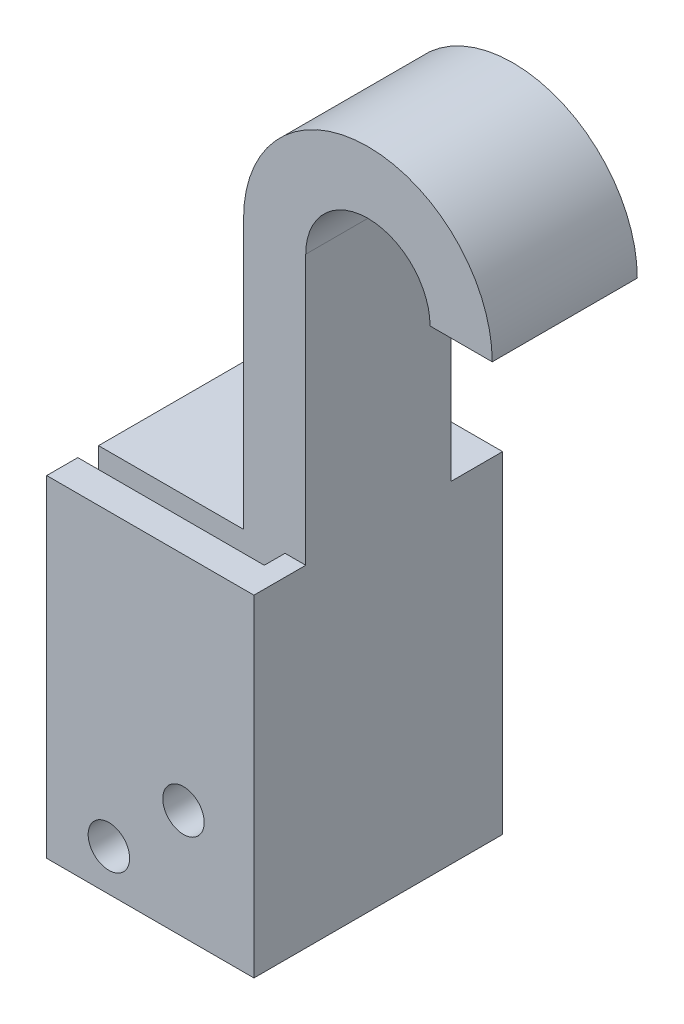
ISO-10303-21;
HEADER;
FILE_DESCRIPTION(('STEP AP214'),'2;1');
FILE_NAME('part.step','',(''),(''),'','','');
FILE_SCHEMA(('AUTOMOTIVE_DESIGN { 1 0 10303 214 1 1 1 1 }'));
ENDSEC;
DATA;
#1=APPLICATION_CONTEXT('core data for automotive mechanical design processes');
#2=APPLICATION_PROTOCOL_DEFINITION('international standard','automotive_design',2000,#1);
#3=PRODUCT_CONTEXT('',#1,'mechanical');
#4=PRODUCT('Part','Part','',(#3));
#5=PRODUCT_RELATED_PRODUCT_CATEGORY('part','',(#4));
#6=PRODUCT_DEFINITION_FORMATION('','',#4);
#7=PRODUCT_DEFINITION_CONTEXT('part definition',#1,'design');
#8=PRODUCT_DEFINITION('design','',#6,#7);
#9=PRODUCT_DEFINITION_SHAPE('','',#8);
#10=(LENGTH_UNIT() NAMED_UNIT(*) SI_UNIT(.MILLI.,.METRE.));
#11=(NAMED_UNIT(*) PLANE_ANGLE_UNIT() SI_UNIT($,.RADIAN.));
#12=(NAMED_UNIT(*) SI_UNIT($,.STERADIAN.) SOLID_ANGLE_UNIT());
#13=UNCERTAINTY_MEASURE_WITH_UNIT(LENGTH_MEASURE(1.E-05),#10,'distance_accuracy_value','');
#14=(GEOMETRIC_REPRESENTATION_CONTEXT(3) GLOBAL_UNCERTAINTY_ASSIGNED_CONTEXT((#13)) GLOBAL_UNIT_ASSIGNED_CONTEXT((#10,
#11,#12)) REPRESENTATION_CONTEXT('',''));
#15=CARTESIAN_POINT('',(0.,0.,0.));
#16=DIRECTION('',(0.,0.,1.));
#17=DIRECTION('',(1.,0.,0.));
#18=AXIS2_PLACEMENT_3D('',#15,#16,#17);
#19=CARTESIAN_POINT('',(0.,177.8,76.2));
#20=DIRECTION('',(0.,1.,0.));
#21=DIRECTION('',(-1.,0.,0.));
#22=AXIS2_PLACEMENT_3D('',#19,#20,#21);
#23=PLANE('',#22);
#24=DIRECTION('',(0.,0.,-1.));
#25=VECTOR('',#24,1.);
#26=CARTESIAN_POINT('',(25.4,177.8,76.2));
#27=LINE('',#26,#25);
#28=CARTESIAN_POINT('',(25.4,177.8,44.45));
#29=VERTEX_POINT('',#28);
#30=CARTESIAN_POINT('',(25.4,177.8,-44.45));
#31=VERTEX_POINT('',#30);
#32=EDGE_CURVE('E336',#29,#31,#27,.T.);
#33=ORIENTED_EDGE('',*,*,#32,.T.);
#34=DIRECTION('',(-1.,0.,0.));
#35=VECTOR('',#34,1.);
#36=CARTESIAN_POINT('',(50.8,177.8,-44.45));
#37=LINE('',#36,#35);
#38=CARTESIAN_POINT('',(-63.5,177.8,-44.45));
#39=VERTEX_POINT('',#38);
#40=EDGE_CURVE('E186',#31,#39,#37,.T.);
#41=ORIENTED_EDGE('',*,*,#40,.T.);
#42=DIRECTION('',(0.,0.,-1.));
#43=VECTOR('',#42,1.);
#44=CARTESIAN_POINT('',(-63.5,177.8,76.2));
#45=LINE('',#44,#43);
#46=CARTESIAN_POINT('',(-63.5,177.8,44.45));
#47=VERTEX_POINT('',#46);
#48=EDGE_CURVE('E283',#47,#39,#45,.T.);
#49=ORIENTED_EDGE('',*,*,#48,.F.);
#50=DIRECTION('',(-1.,0.,0.));
#51=VECTOR('',#50,1.);
#52=CARTESIAN_POINT('',(50.8,177.8,44.45));
#53=LINE('',#52,#51);
#54=EDGE_CURVE('E221',#29,#47,#53,.T.);
#55=ORIENTED_EDGE('',*,*,#54,.F.);
#56=EDGE_LOOP('',(#33,#41,#49,#55));
#57=FACE_BOUND('',#56,.T.);
#58=ADVANCED_FACE('F35',(#57),#23,.T.);
#59=DIRECTION('',(-1.,0.,0.));
#60=VECTOR('',#59,1.);
#61=CARTESIAN_POINT('',(50.8,177.8,-57.15));
#62=LINE('',#61,#60);
#63=CARTESIAN_POINT('',(50.8,177.8,-57.15));
#64=VERTEX_POINT('',#63);
#65=CARTESIAN_POINT('',(-63.5,177.8,-57.15));
#66=VERTEX_POINT('',#65);
#67=EDGE_CURVE('E193',#64,#66,#62,.T.);
#68=ORIENTED_EDGE('',*,*,#67,.F.);
#69=DIRECTION('',(0.,0.,-1.));
#70=VECTOR('',#69,1.);
#71=CARTESIAN_POINT('',(50.8,177.8,-44.45));
#72=LINE('',#71,#70);
#73=CARTESIAN_POINT('',(50.8,177.8,-44.45));
#74=VERTEX_POINT('',#73);
#75=EDGE_CURVE('E207',#74,#64,#72,.T.);
#76=ORIENTED_EDGE('',*,*,#75,.F.);
#77=DIRECTION('',(1.,0.,0.));
#78=VECTOR('',#77,1.);
#79=CARTESIAN_POINT('',(0.,177.8,-44.45));
#80=LINE('',#79,#78);
#81=CARTESIAN_POINT('',(63.5,177.8,-44.45));
#82=VERTEX_POINT('',#81);
#83=EDGE_CURVE('E192',#74,#82,#80,.T.);
#84=ORIENTED_EDGE('',*,*,#83,.T.);
#85=DIRECTION('',(0.,0.,-1.));
#86=VECTOR('',#85,1.);
#87=CARTESIAN_POINT('',(63.5,177.8,76.2));
#88=LINE('',#87,#86);
#89=CARTESIAN_POINT('',(63.5,177.8,-76.2));
#90=VERTEX_POINT('',#89);
#91=EDGE_CURVE('E282',#82,#90,#88,.T.);
#92=ORIENTED_EDGE('',*,*,#91,.T.);
#93=DIRECTION('',(1.,0.,0.));
#94=VECTOR('',#93,1.);
#95=CARTESIAN_POINT('',(0.,177.8,-76.2));
#96=LINE('',#95,#94);
#97=CARTESIAN_POINT('',(-63.5,177.8,-76.2));
#98=VERTEX_POINT('',#97);
#99=EDGE_CURVE('E330',#98,#90,#96,.T.);
#100=ORIENTED_EDGE('',*,*,#99,.F.);
#101=EDGE_CURVE('E274',#66,#98,#45,.T.);
#102=ORIENTED_EDGE('',*,*,#101,.F.);
#103=EDGE_LOOP('',(#68,#76,#84,#92,#100,#102));
#104=FACE_BOUND('',#103,.T.);
#105=ADVANCED_FACE('F393',(#104),#23,.T.);
#106=CARTESIAN_POINT('',(-63.5,177.8,76.2));
#107=DIRECTION('',(1.,0.,0.));
#108=DIRECTION('',(0.,1.,0.));
#109=AXIS2_PLACEMENT_3D('',#106,#107,#108);
#110=PLANE('',#109);
#111=DIRECTION('',(0.,-1.,0.));
#112=VECTOR('',#111,1.);
#113=CARTESIAN_POINT('',(-63.5,-12.7,-44.45));
#114=LINE('',#113,#112);
#115=CARTESIAN_POINT('',(-63.5,-12.7,-44.45));
#116=VERTEX_POINT('',#115);
#117=EDGE_CURVE('E198',#39,#116,#114,.T.);
#118=ORIENTED_EDGE('',*,*,#117,.T.);
#119=DIRECTION('',(0.,0.,-1.));
#120=VECTOR('',#119,1.);
#121=CARTESIAN_POINT('',(-63.5,-12.7,-44.45));
#122=LINE('',#121,#120);
#123=CARTESIAN_POINT('',(-63.5,-12.7,-57.15));
#124=VERTEX_POINT('',#123);
#125=EDGE_CURVE('E185',#116,#124,#122,.T.);
#126=ORIENTED_EDGE('',*,*,#125,.T.);
#127=DIRECTION('',(0.,-1.,0.));
#128=VECTOR('',#127,1.);
#129=CARTESIAN_POINT('',(-63.5,-12.7,-57.15));
#130=LINE('',#129,#128);
#131=EDGE_CURVE('E195',#66,#124,#130,.T.);
#132=ORIENTED_EDGE('',*,*,#131,.F.);
#133=ORIENTED_EDGE('',*,*,#101,.T.);
#134=DIRECTION('',(0.,-1.,0.));
#135=VECTOR('',#134,1.);
#136=CARTESIAN_POINT('',(-63.5,177.8,-76.2));
#137=LINE('',#136,#135);
#138=CARTESIAN_POINT('',(-63.5,-25.4,-76.2));
#139=VERTEX_POINT('',#138);
#140=EDGE_CURVE('E262',#98,#139,#137,.T.);
#141=ORIENTED_EDGE('',*,*,#140,.T.);
#142=DIRECTION('',(0.,0.,-1.));
#143=VECTOR('',#142,1.);
#144=CARTESIAN_POINT('',(-63.5,-25.4,76.2));
#145=LINE('',#144,#143);
#146=CARTESIAN_POINT('',(-63.5,-25.4,76.2));
#147=VERTEX_POINT('',#146);
#148=EDGE_CURVE('E287',#147,#139,#145,.T.);
#149=ORIENTED_EDGE('',*,*,#148,.F.);
#150=DIRECTION('',(0.,-1.,0.));
#151=VECTOR('',#150,1.);
#152=CARTESIAN_POINT('',(-63.5,177.8,76.2));
#153=LINE('',#152,#151);
#154=CARTESIAN_POINT('',(-63.5,177.8,76.2));
#155=VERTEX_POINT('',#154);
#156=EDGE_CURVE('E267',#155,#147,#153,.T.);
#157=ORIENTED_EDGE('',*,*,#156,.F.);
#158=CARTESIAN_POINT('',(-63.5,177.8,57.15));
#159=VERTEX_POINT('',#158);
#160=EDGE_CURVE('E279',#155,#159,#45,.T.);
#161=ORIENTED_EDGE('',*,*,#160,.T.);
#162=DIRECTION('',(0.,-1.,0.));
#163=VECTOR('',#162,1.);
#164=CARTESIAN_POINT('',(-63.5,-12.7,57.15));
#165=LINE('',#164,#163);
#166=CARTESIAN_POINT('',(-63.5,-12.7,57.15));
#167=VERTEX_POINT('',#166);
#168=EDGE_CURVE('E235',#159,#167,#165,.T.);
#169=ORIENTED_EDGE('',*,*,#168,.T.);
#170=DIRECTION('',(0.,0.,1.));
#171=VECTOR('',#170,1.);
#172=CARTESIAN_POINT('',(-63.5,-12.7,44.45));
#173=LINE('',#172,#171);
#174=CARTESIAN_POINT('',(-63.5,-12.7,44.45));
#175=VERTEX_POINT('',#174);
#176=EDGE_CURVE('E244',#175,#167,#173,.T.);
#177=ORIENTED_EDGE('',*,*,#176,.F.);
#178=DIRECTION('',(0.,-1.,0.));
#179=VECTOR('',#178,1.);
#180=CARTESIAN_POINT('',(-63.5,-12.7,44.45));
#181=LINE('',#180,#179);
#182=EDGE_CURVE('E224',#47,#175,#181,.T.);
#183=ORIENTED_EDGE('',*,*,#182,.F.);
#184=ORIENTED_EDGE('',*,*,#48,.T.);
#185=EDGE_LOOP('',(#118,#126,#132,#133,#141,#149,#157,#161,#169,#177,#183,#184));
#186=FACE_BOUND('',#185,.T.);
#187=ADVANCED_FACE('F356',(#186),#110,.F.);
#188=CARTESIAN_POINT('',(20.32,41.91,-76.2));
#189=DIRECTION('',(0.,0.,1.));
#190=DIRECTION('',(1.,0.,0.));
#191=AXIS2_PLACEMENT_3D('',#188,#189,#190);
#192=CYLINDRICAL_SURFACE('',#191,12.7);
#193=CARTESIAN_POINT('',(20.32,41.91,44.45));
#194=DIRECTION('',(0.,0.,1.));
#195=DIRECTION('',(1.,0.,0.));
#196=AXIS2_PLACEMENT_3D('',#193,#194,#195);
#197=CIRCLE('',#196,12.7);
#198=CARTESIAN_POINT('',(33.02,41.91,44.45));
#199=VERTEX_POINT('',#198);
#200=EDGE_CURVE('E251',#199,#199,#197,.F.);
#201=CARTESIAN_POINT('',(20.32,41.91,-44.45));
#202=DIRECTION('',(0.,0.,-1.));
#203=DIRECTION('',(-1.,0.,0.));
#204=AXIS2_PLACEMENT_3D('',#201,#202,#203);
#205=CIRCLE('',#204,12.7);
#206=CARTESIAN_POINT('',(33.02,41.91,-44.45));
#207=VERTEX_POINT('',#206);
#208=EDGE_CURVE('E214',#207,#207,#205,.F.);
#209=CARTESIAN_POINT('',(33.02,41.91,44.45));
#210=CARTESIAN_POINT('',(33.02,41.91,43.5239583333333));
#211=CARTESIAN_POINT('',(33.02,41.91,42.5979166666666));
#212=CARTESIAN_POINT('',(33.02,41.91,40.7458333333333));
#213=CARTESIAN_POINT('',(33.02,41.91,39.8197916666667));
#214=CARTESIAN_POINT('',(33.02,41.91,37.9677083333333));
#215=CARTESIAN_POINT('',(33.02,41.91,37.0416666666667));
#216=CARTESIAN_POINT('',(33.02,41.91,35.1895833333333));
#217=CARTESIAN_POINT('',(33.02,41.91,34.2635416666667));
#218=CARTESIAN_POINT('',(33.02,41.91,32.4114583333333));
#219=CARTESIAN_POINT('',(33.02,41.91,31.4854166666667));
#220=CARTESIAN_POINT('',(33.02,41.91,29.6333333333333));
#221=CARTESIAN_POINT('',(33.02,41.91,28.7072916666667));
#222=CARTESIAN_POINT('',(33.02,41.91,26.8552083333333));
#223=CARTESIAN_POINT('',(33.02,41.91,25.9291666666667));
#224=CARTESIAN_POINT('',(33.02,41.91,24.0770833333333));
#225=CARTESIAN_POINT('',(33.02,41.91,23.1510416666667));
#226=CARTESIAN_POINT('',(33.02,41.91,21.2989583333333));
#227=CARTESIAN_POINT('',(33.02,41.91,20.3729166666667));
#228=CARTESIAN_POINT('',(33.02,41.91,18.5208333333333));
#229=CARTESIAN_POINT('',(33.02,41.91,17.5947916666667));
#230=CARTESIAN_POINT('',(33.02,41.91,15.7427083333333));
#231=CARTESIAN_POINT('',(33.02,41.91,14.8166666666667));
#232=CARTESIAN_POINT('',(33.02,41.91,12.9645833333333));
#233=CARTESIAN_POINT('',(33.02,41.91,12.0385416666667));
#234=CARTESIAN_POINT('',(33.02,41.91,10.1864583333333));
#235=CARTESIAN_POINT('',(33.02,41.91,9.26041666666666));
#236=CARTESIAN_POINT('',(33.02,41.91,7.40833333333332));
#237=CARTESIAN_POINT('',(33.02,41.91,6.48229166666665));
#238=CARTESIAN_POINT('',(33.02,41.91,4.63020833333332));
#239=CARTESIAN_POINT('',(33.02,41.91,3.70416666666666));
#240=CARTESIAN_POINT('',(33.02,41.91,1.85208333333333));
#241=CARTESIAN_POINT('',(33.02,41.91,0.926041666666664));
#242=CARTESIAN_POINT('',(33.02,41.91,-0.926041666666669));
#243=CARTESIAN_POINT('',(33.02,41.91,-1.85208333333334));
#244=CARTESIAN_POINT('',(33.02,41.91,-3.70416666666667));
#245=CARTESIAN_POINT('',(33.02,41.91,-4.63020833333334));
#246=CARTESIAN_POINT('',(33.02,41.91,-6.48229166666668));
#247=CARTESIAN_POINT('',(33.02,41.91,-7.40833333333334));
#248=CARTESIAN_POINT('',(33.02,41.91,-9.26041666666667));
#249=CARTESIAN_POINT('',(33.02,41.91,-10.1864583333333));
#250=CARTESIAN_POINT('',(33.02,41.91,-12.0385416666667));
#251=CARTESIAN_POINT('',(33.02,41.91,-12.9645833333333));
#252=CARTESIAN_POINT('',(33.02,41.91,-14.8166666666667));
#253=CARTESIAN_POINT('',(33.02,41.91,-15.7427083333333));
#254=CARTESIAN_POINT('',(33.02,41.91,-17.5947916666667));
#255=CARTESIAN_POINT('',(33.02,41.91,-18.5208333333333));
#256=CARTESIAN_POINT('',(33.02,41.91,-20.3729166666667));
#257=CARTESIAN_POINT('',(33.02,41.91,-21.2989583333333));
#258=CARTESIAN_POINT('',(33.02,41.91,-23.1510416666667));
#259=CARTESIAN_POINT('',(33.02,41.91,-24.0770833333333));
#260=CARTESIAN_POINT('',(33.02,41.91,-25.9291666666667));
#261=CARTESIAN_POINT('',(33.02,41.91,-26.8552083333333));
#262=CARTESIAN_POINT('',(33.02,41.91,-28.7072916666667));
#263=CARTESIAN_POINT('',(33.02,41.91,-29.6333333333333));
#264=CARTESIAN_POINT('',(33.02,41.91,-31.4854166666667));
#265=CARTESIAN_POINT('',(33.02,41.91,-32.4114583333333));
#266=CARTESIAN_POINT('',(33.02,41.91,-34.2635416666667));
#267=CARTESIAN_POINT('',(33.02,41.91,-35.1895833333333));
#268=CARTESIAN_POINT('',(33.02,41.91,-37.0416666666667));
#269=CARTESIAN_POINT('',(33.02,41.91,-37.9677083333333));
#270=CARTESIAN_POINT('',(33.02,41.91,-39.8197916666667));
#271=CARTESIAN_POINT('',(33.02,41.91,-40.7458333333333));
#272=CARTESIAN_POINT('',(33.02,41.91,-42.5979166666667));
#273=CARTESIAN_POINT('',(33.02,41.91,-43.5239583333333));
#274=CARTESIAN_POINT('',(33.02,41.91,-44.45));
#275=B_SPLINE_CURVE_WITH_KNOTS('',3,(#209,#210,#211,#212,#213,#214,#215,#216,#217,#218,#219,
#220,#221,#222,#223,#224,#225,#226,#227,#228,#229,#230,#231,#232,#233,#234,#235,#236,#237,#238,
#239,#240,#241,#242,#243,#244,#245,#246,#247,#248,#249,#250,#251,#252,#253,#254,#255,#256,#257,
#258,#259,#260,#261,#262,#263,#264,#265,#266,#267,#268,#269,#270,#271,#272,#273,#274),
.UNSPECIFIED.,.F.,.F.,(4,2,2,2,2,2,2,2,2,2,2,2,2,2,2,2,2,2,2,2,2,2,2,2,2,2,2,2,2,2,2,2,4),(0.,
2.77812500000001,5.55625,8.334375,11.1125,13.890625,16.66875,19.446875,22.225,25.003125,
27.78125,30.559375,33.3375,36.115625,38.89375,41.671875,44.45,47.228125,50.00625,52.784375,
55.5625,58.340625,61.11875,63.896875,66.675,69.453125,72.23125,75.009375,77.7875,80.565625,
83.34375,86.121875,88.9),.UNSPECIFIED.);
#276=EDGE_CURVE('BSEAM440',#199,#207,#275,.T.);
#277=ORIENTED_EDGE('',*,*,#200,.F.);
#278=ORIENTED_EDGE('',*,*,#208,.F.);
#279=ORIENTED_EDGE('',*,*,#276,.T.);
#280=ORIENTED_EDGE('',*,*,#276,.F.);
#281=EDGE_LOOP('',(#277,#279,#278,#280));
#282=FACE_BOUND('',#281,.T.);
#283=ADVANCED_FACE('F440',(#282),#192,.F.);
#284=CARTESIAN_POINT('',(-25.4,0.,-76.2));
#285=DIRECTION('',(0.,0.,1.));
#286=DIRECTION('',(1.,0.,0.));
#287=AXIS2_PLACEMENT_3D('',#284,#285,#286);
#288=CYLINDRICAL_SURFACE('',#287,12.7);
#289=CARTESIAN_POINT('',(-25.4,0.,44.45));
#290=DIRECTION('',(0.,0.,1.));
#291=DIRECTION('',(1.,0.,0.));
#292=AXIS2_PLACEMENT_3D('',#289,#290,#291);
#293=CIRCLE('',#292,12.7);
#294=CARTESIAN_POINT('',(-25.4,-12.7,44.45));
#295=VERTEX_POINT('',#294);
#296=EDGE_CURVE('E345',#295,#295,#293,.F.);
#297=ORIENTED_EDGE('',*,*,#296,.F.);
#298=EDGE_LOOP('',(#297));
#299=FACE_BOUND('',#298,.T.);
#300=CARTESIAN_POINT('',(-25.4,0.,-44.45));
#301=DIRECTION('',(0.,0.,-1.));
#302=DIRECTION('',(-1.,0.,0.));
#303=AXIS2_PLACEMENT_3D('',#300,#301,#302);
#304=CIRCLE('',#303,12.7);
#305=CARTESIAN_POINT('',(-25.4,-12.7,-44.45));
#306=VERTEX_POINT('',#305);
#307=EDGE_CURVE('E11',#306,#306,#304,.F.);
#308=ORIENTED_EDGE('',*,*,#307,.F.);
#309=EDGE_LOOP('',(#308));
#310=FACE_BOUND('',#309,.T.);
#311=ADVANCED_FACE('F429',(#299,#310),#288,.F.);
#312=CARTESIAN_POINT('',(20.32,41.91,-57.15));
#313=DIRECTION('',(0.,0.,-1.));
#314=DIRECTION('',(-1.,0.,0.));
#315=AXIS2_PLACEMENT_3D('',#312,#313,#314);
#316=CIRCLE('',#315,12.7);
#317=CARTESIAN_POINT('',(33.02,41.91,-57.15));
#318=VERTEX_POINT('',#317);
#319=EDGE_CURVE('E209',#318,#318,#316,.F.);
#320=CARTESIAN_POINT('',(20.32,41.91,-76.2));
#321=DIRECTION('',(0.,0.,1.));
#322=DIRECTION('',(1.,0.,0.));
#323=AXIS2_PLACEMENT_3D('',#320,#321,#322);
#324=CIRCLE('',#323,12.7);
#325=CARTESIAN_POINT('',(33.02,41.91,-76.2));
#326=VERTEX_POINT('',#325);
#327=EDGE_CURVE('E259',#326,#326,#324,.T.);
#328=CARTESIAN_POINT('',(33.02,41.91,-57.15));
#329=CARTESIAN_POINT('',(33.02,41.91,-57.3484375));
#330=CARTESIAN_POINT('',(33.02,41.91,-57.546875));
#331=CARTESIAN_POINT('',(33.02,41.91,-57.94375));
#332=CARTESIAN_POINT('',(33.02,41.91,-58.1421875));
#333=CARTESIAN_POINT('',(33.02,41.91,-58.5390625));
#334=CARTESIAN_POINT('',(33.02,41.91,-58.7375));
#335=CARTESIAN_POINT('',(33.02,41.91,-59.134375));
#336=CARTESIAN_POINT('',(33.02,41.91,-59.3328125));
#337=CARTESIAN_POINT('',(33.02,41.91,-59.7296875));
#338=CARTESIAN_POINT('',(33.02,41.91,-59.928125));
#339=CARTESIAN_POINT('',(33.02,41.91,-60.325));
#340=CARTESIAN_POINT('',(33.02,41.91,-60.5234375));
#341=CARTESIAN_POINT('',(33.02,41.91,-60.9203125));
#342=CARTESIAN_POINT('',(33.02,41.91,-61.11875));
#343=CARTESIAN_POINT('',(33.02,41.91,-61.515625));
#344=CARTESIAN_POINT('',(33.02,41.91,-61.7140625));
#345=CARTESIAN_POINT('',(33.02,41.91,-62.1109375));
#346=CARTESIAN_POINT('',(33.02,41.91,-62.309375));
#347=CARTESIAN_POINT('',(33.02,41.91,-62.70625));
#348=CARTESIAN_POINT('',(33.02,41.91,-62.9046875));
#349=CARTESIAN_POINT('',(33.02,41.91,-63.3015625));
#350=CARTESIAN_POINT('',(33.02,41.91,-63.5));
#351=CARTESIAN_POINT('',(33.02,41.91,-63.896875));
#352=CARTESIAN_POINT('',(33.02,41.91,-64.0953125));
#353=CARTESIAN_POINT('',(33.02,41.91,-64.4921875));
#354=CARTESIAN_POINT('',(33.02,41.91,-64.690625));
#355=CARTESIAN_POINT('',(33.02,41.91,-65.0875));
#356=CARTESIAN_POINT('',(33.02,41.91,-65.2859375));
#357=CARTESIAN_POINT('',(33.02,41.91,-65.6828125));
#358=CARTESIAN_POINT('',(33.02,41.91,-65.88125));
#359=CARTESIAN_POINT('',(33.02,41.91,-66.278125));
#360=CARTESIAN_POINT('',(33.02,41.91,-66.4765625));
#361=CARTESIAN_POINT('',(33.02,41.91,-66.8734375));
#362=CARTESIAN_POINT('',(33.02,41.91,-67.071875));
#363=CARTESIAN_POINT('',(33.02,41.91,-67.46875));
#364=CARTESIAN_POINT('',(33.02,41.91,-67.6671875));
#365=CARTESIAN_POINT('',(33.02,41.91,-68.0640625));
#366=CARTESIAN_POINT('',(33.02,41.91,-68.2625));
#367=CARTESIAN_POINT('',(33.02,41.91,-68.659375));
#368=CARTESIAN_POINT('',(33.02,41.91,-68.8578125));
#369=CARTESIAN_POINT('',(33.02,41.91,-69.2546875));
#370=CARTESIAN_POINT('',(33.02,41.91,-69.453125));
#371=CARTESIAN_POINT('',(33.02,41.91,-69.85));
#372=CARTESIAN_POINT('',(33.02,41.91,-70.0484375));
#373=CARTESIAN_POINT('',(33.02,41.91,-70.4453125));
#374=CARTESIAN_POINT('',(33.02,41.91,-70.64375));
#375=CARTESIAN_POINT('',(33.02,41.91,-71.040625));
#376=CARTESIAN_POINT('',(33.02,41.91,-71.2390625));
#377=CARTESIAN_POINT('',(33.02,41.91,-71.6359375));
#378=CARTESIAN_POINT('',(33.02,41.91,-71.834375));
#379=CARTESIAN_POINT('',(33.02,41.91,-72.23125));
#380=CARTESIAN_POINT('',(33.02,41.91,-72.4296875));
#381=CARTESIAN_POINT('',(33.02,41.91,-72.8265625));
#382=CARTESIAN_POINT('',(33.02,41.91,-73.025));
#383=CARTESIAN_POINT('',(33.02,41.91,-73.421875));
#384=CARTESIAN_POINT('',(33.02,41.91,-73.6203125));
#385=CARTESIAN_POINT('',(33.02,41.91,-74.0171875));
#386=CARTESIAN_POINT('',(33.02,41.91,-74.215625));
#387=CARTESIAN_POINT('',(33.02,41.91,-74.6125));
#388=CARTESIAN_POINT('',(33.02,41.91,-74.8109375));
#389=CARTESIAN_POINT('',(33.02,41.91,-75.2078125));
#390=CARTESIAN_POINT('',(33.02,41.91,-75.40625));
#391=CARTESIAN_POINT('',(33.02,41.91,-75.803125));
#392=CARTESIAN_POINT('',(33.02,41.91,-76.0015625));
#393=CARTESIAN_POINT('',(33.02,41.91,-76.2));
#394=B_SPLINE_CURVE_WITH_KNOTS('',3,(#328,#329,#330,#331,#332,#333,#334,#335,#336,#337,#338,
#339,#340,#341,#342,#343,#344,#345,#346,#347,#348,#349,#350,#351,#352,#353,#354,#355,#356,#357,
#358,#359,#360,#361,#362,#363,#364,#365,#366,#367,#368,#369,#370,#371,#372,#373,#374,#375,#376,
#377,#378,#379,#380,#381,#382,#383,#384,#385,#386,#387,#388,#389,#390,#391,#392,#393),
.UNSPECIFIED.,.F.,.F.,(4,2,2,2,2,2,2,2,2,2,2,2,2,2,2,2,2,2,2,2,2,2,2,2,2,2,2,2,2,2,2,2,4),(0.,
0.5953125,1.190625,1.7859375,2.38125,2.9765625,3.571875,4.1671875,4.7625,5.3578125,5.953125,
6.5484375,7.14375,7.7390625,8.334375,8.92968750000001,9.52500000000001,10.1203125,10.715625,
11.3109375,11.90625,12.5015625,13.096875,13.6921875,14.2875,14.8828125,15.478125,16.0734375,
16.66875,17.2640625,17.859375,18.4546875,19.05),.UNSPECIFIED.);
#395=EDGE_CURVE('BSEAM441',#318,#326,#394,.T.);
#396=ORIENTED_EDGE('',*,*,#319,.T.);
#397=ORIENTED_EDGE('',*,*,#327,.F.);
#398=ORIENTED_EDGE('',*,*,#395,.T.);
#399=ORIENTED_EDGE('',*,*,#395,.F.);
#400=EDGE_LOOP('',(#396,#398,#397,#399));
#401=FACE_BOUND('',#400,.T.);
#402=ADVANCED_FACE('F441',(#401),#192,.F.);
#403=CARTESIAN_POINT('',(-25.4,0.,-57.15));
#404=DIRECTION('',(0.,0.,-1.));
#405=DIRECTION('',(-1.,0.,0.));
#406=AXIS2_PLACEMENT_3D('',#403,#404,#405);
#407=CIRCLE('',#406,12.7);
#408=CARTESIAN_POINT('',(-25.4,-12.7,-57.15));
#409=VERTEX_POINT('',#408);
#410=EDGE_CURVE('E43',#409,#409,#407,.F.);
#411=ORIENTED_EDGE('',*,*,#410,.T.);
#412=EDGE_LOOP('',(#411));
#413=FACE_BOUND('',#412,.T.);
#414=CARTESIAN_POINT('',(-25.4,0.,-76.2));
#415=DIRECTION('',(0.,0.,1.));
#416=DIRECTION('',(1.,0.,0.));
#417=AXIS2_PLACEMENT_3D('',#414,#415,#416);
#418=CIRCLE('',#417,12.7);
#419=CARTESIAN_POINT('',(-12.7,0.,-76.2));
#420=VERTEX_POINT('',#419);
#421=EDGE_CURVE('E258',#420,#420,#418,.T.);
#422=ORIENTED_EDGE('',*,*,#421,.F.);
#423=EDGE_LOOP('',(#422));
#424=FACE_BOUND('',#423,.T.);
#425=ADVANCED_FACE('F349',(#413,#424),#288,.F.);
#426=CARTESIAN_POINT('',(0.,0.,44.45));
#427=DIRECTION('',(0.,0.,1.));
#428=DIRECTION('',(1.,0.,0.));
#429=AXIS2_PLACEMENT_3D('',#426,#427,#428);
#430=PLANE('',#429);
#431=DIRECTION('',(0.,1.,0.));
#432=VECTOR('',#431,1.);
#433=CARTESIAN_POINT('',(25.4,0.,44.45));
#434=LINE('',#433,#432);
#435=CARTESIAN_POINT('',(25.4,342.9,44.45));
#436=VERTEX_POINT('',#435);
#437=EDGE_CURVE('E302',#29,#436,#434,.T.);
#438=ORIENTED_EDGE('',*,*,#437,.F.);
#439=ORIENTED_EDGE('',*,*,#54,.T.);
#440=ORIENTED_EDGE('',*,*,#182,.T.);
#441=DIRECTION('',(1.,0.,0.));
#442=VECTOR('',#441,1.);
#443=CARTESIAN_POINT('',(50.8,-12.7,44.45));
#444=LINE('',#443,#442);
#445=EDGE_CURVE('E227',#175,#295,#444,.T.);
#446=ORIENTED_EDGE('',*,*,#445,.T.);
#447=ORIENTED_EDGE('',*,*,#296,.T.);
#448=CARTESIAN_POINT('',(50.8,-12.7,44.45));
#449=VERTEX_POINT('',#448);
#450=EDGE_CURVE('E226',#295,#449,#444,.T.);
#451=ORIENTED_EDGE('',*,*,#450,.T.);
#452=DIRECTION('',(0.,1.,0.));
#453=VECTOR('',#452,1.);
#454=CARTESIAN_POINT('',(50.8,-12.7,44.45));
#455=LINE('',#454,#453);
#456=CARTESIAN_POINT('',(50.8,177.8,44.45));
#457=VERTEX_POINT('',#456);
#458=EDGE_CURVE('E218',#449,#457,#455,.T.);
#459=ORIENTED_EDGE('',*,*,#458,.T.);
#460=DIRECTION('',(1.,0.,0.));
#461=VECTOR('',#460,1.);
#462=CARTESIAN_POINT('',(0.,177.8,44.45));
#463=LINE('',#462,#461);
#464=CARTESIAN_POINT('',(63.5,177.8,44.45));
#465=VERTEX_POINT('',#464);
#466=EDGE_CURVE('E290',#457,#465,#463,.T.);
#467=ORIENTED_EDGE('',*,*,#466,.T.);
#468=DIRECTION('',(0.,1.,0.));
#469=VECTOR('',#468,1.);
#470=CARTESIAN_POINT('',(63.5,0.,44.45));
#471=LINE('',#470,#469);
#472=CARTESIAN_POINT('',(63.5,342.9,44.45));
#473=VERTEX_POINT('',#472);
#474=EDGE_CURVE('E304',#465,#473,#471,.T.);
#475=ORIENTED_EDGE('',*,*,#474,.T.);
#476=CARTESIAN_POINT('',(101.6,342.9,44.45));
#477=DIRECTION('',(0.,0.,1.));
#478=DIRECTION('',(1.,0.,0.));
#479=AXIS2_PLACEMENT_3D('',#476,#477,#478);
#480=CIRCLE('',#479,38.1);
#481=CARTESIAN_POINT('',(139.7,342.9,44.45));
#482=VERTEX_POINT('',#481);
#483=EDGE_CURVE('E293',#482,#473,#480,.T.);
#484=ORIENTED_EDGE('',*,*,#483,.F.);
#485=DIRECTION('',(1.,0.,0.));
#486=VECTOR('',#485,1.);
#487=CARTESIAN_POINT('',(0.,342.9,44.45));
#488=LINE('',#487,#486);
#489=CARTESIAN_POINT('',(177.8,342.9,44.45));
#490=VERTEX_POINT('',#489);
#491=EDGE_CURVE('E296',#482,#490,#488,.T.);
#492=ORIENTED_EDGE('',*,*,#491,.T.);
#493=CARTESIAN_POINT('',(101.6,342.9,44.45));
#494=DIRECTION('',(0.,0.,1.));
#495=DIRECTION('',(1.,0.,0.));
#496=AXIS2_PLACEMENT_3D('',#493,#494,#495);
#497=CIRCLE('',#496,76.2);
#498=EDGE_CURVE('E299',#490,#436,#497,.T.);
#499=ORIENTED_EDGE('',*,*,#498,.T.);
#500=EDGE_LOOP('',(#438,#439,#440,#446,#447,#451,#459,#467,#475,#484,#492,#499));
#501=FACE_BOUND('',#500,.T.);
#502=ORIENTED_EDGE('',*,*,#200,.T.);
#503=EDGE_LOOP('',(#502));
#504=FACE_BOUND('',#503,.T.);
#505=ADVANCED_FACE('F368',(#501,#504),#430,.T.);
#506=CARTESIAN_POINT('',(0.,0.,-44.45));
#507=DIRECTION('',(0.,0.,1.));
#508=DIRECTION('',(1.,0.,0.));
#509=AXIS2_PLACEMENT_3D('',#506,#507,#508);
#510=PLANE('',#509);
#511=ORIENTED_EDGE('',*,*,#83,.F.);
#512=DIRECTION('',(0.,1.,0.));
#513=VECTOR('',#512,1.);
#514=CARTESIAN_POINT('',(50.8,-12.7,-44.45));
#515=LINE('',#514,#513);
#516=CARTESIAN_POINT('',(50.8,-12.7,-44.45));
#517=VERTEX_POINT('',#516);
#518=EDGE_CURVE('E178',#517,#74,#515,.T.);
#519=ORIENTED_EDGE('',*,*,#518,.F.);
#520=DIRECTION('',(1.,0.,0.));
#521=VECTOR('',#520,1.);
#522=CARTESIAN_POINT('',(50.8,-12.7,-44.45));
#523=LINE('',#522,#521);
#524=EDGE_CURVE('E171',#306,#517,#523,.T.);
#525=ORIENTED_EDGE('',*,*,#524,.F.);
#526=ORIENTED_EDGE('',*,*,#307,.T.);
#527=EDGE_CURVE('E50',#116,#306,#523,.T.);
#528=ORIENTED_EDGE('',*,*,#527,.F.);
#529=ORIENTED_EDGE('',*,*,#117,.F.);
#530=ORIENTED_EDGE('',*,*,#40,.F.);
#531=DIRECTION('',(0.,1.,0.));
#532=VECTOR('',#531,1.);
#533=CARTESIAN_POINT('',(25.4,0.,-44.45));
#534=LINE('',#533,#532);
#535=CARTESIAN_POINT('',(25.4,342.9,-44.45));
#536=VERTEX_POINT('',#535);
#537=EDGE_CURVE('E314',#31,#536,#534,.T.);
#538=ORIENTED_EDGE('',*,*,#537,.T.);
#539=CARTESIAN_POINT('',(101.6,342.9,-44.45));
#540=DIRECTION('',(0.,0.,1.));
#541=DIRECTION('',(1.,0.,0.));
#542=AXIS2_PLACEMENT_3D('',#539,#540,#541);
#543=CIRCLE('',#542,76.2);
#544=CARTESIAN_POINT('',(177.8,342.9,-44.45));
#545=VERTEX_POINT('',#544);
#546=EDGE_CURVE('E311',#545,#536,#543,.T.);
#547=ORIENTED_EDGE('',*,*,#546,.F.);
#548=DIRECTION('',(1.,0.,0.));
#549=VECTOR('',#548,1.);
#550=CARTESIAN_POINT('',(0.,342.9,-44.45));
#551=LINE('',#550,#549);
#552=CARTESIAN_POINT('',(139.7,342.9,-44.45));
#553=VERTEX_POINT('',#552);
#554=EDGE_CURVE('E309',#553,#545,#551,.T.);
#555=ORIENTED_EDGE('',*,*,#554,.F.);
#556=CARTESIAN_POINT('',(101.6,342.9,-44.45));
#557=DIRECTION('',(0.,0.,1.));
#558=DIRECTION('',(1.,0.,0.));
#559=AXIS2_PLACEMENT_3D('',#556,#557,#558);
#560=CIRCLE('',#559,38.1);
#561=CARTESIAN_POINT('',(63.5,342.9,-44.45));
#562=VERTEX_POINT('',#561);
#563=EDGE_CURVE('E292',#553,#562,#560,.T.);
#564=ORIENTED_EDGE('',*,*,#563,.T.);
#565=DIRECTION('',(0.,1.,0.));
#566=VECTOR('',#565,1.);
#567=CARTESIAN_POINT('',(63.5,0.,-44.45));
#568=LINE('',#567,#566);
#569=EDGE_CURVE('E297',#82,#562,#568,.T.);
#570=ORIENTED_EDGE('',*,*,#569,.F.);
#571=EDGE_LOOP('',(#511,#519,#525,#526,#528,#529,#530,#538,#547,#555,#564,#570));
#572=FACE_BOUND('',#571,.T.);
#573=ORIENTED_EDGE('',*,*,#208,.T.);
#574=EDGE_LOOP('',(#573));
#575=FACE_BOUND('',#574,.T.);
#576=ADVANCED_FACE('F189',(#572,#575),#510,.F.);
#577=DIRECTION('',(0.,0.,1.));
#578=VECTOR('',#577,1.);
#579=CARTESIAN_POINT('',(50.8,177.8,44.45));
#580=LINE('',#579,#578);
#581=CARTESIAN_POINT('',(50.8,177.8,57.15));
#582=VERTEX_POINT('',#581);
#583=EDGE_CURVE('E229',#457,#582,#580,.T.);
#584=ORIENTED_EDGE('',*,*,#583,.T.);
#585=DIRECTION('',(-1.,0.,0.));
#586=VECTOR('',#585,1.);
#587=CARTESIAN_POINT('',(50.8,177.8,57.15));
#588=LINE('',#587,#586);
#589=EDGE_CURVE('E232',#582,#159,#588,.T.);
#590=ORIENTED_EDGE('',*,*,#589,.T.);
#591=ORIENTED_EDGE('',*,*,#160,.F.);
#592=DIRECTION('',(1.,0.,0.));
#593=VECTOR('',#592,1.);
#594=CARTESIAN_POINT('',(0.,177.8,76.2));
#595=LINE('',#594,#593);
#596=CARTESIAN_POINT('',(63.5,177.8,76.2));
#597=VERTEX_POINT('',#596);
#598=EDGE_CURVE('E331',#155,#597,#595,.T.);
#599=ORIENTED_EDGE('',*,*,#598,.T.);
#600=EDGE_CURVE('E284',#597,#465,#88,.T.);
#601=ORIENTED_EDGE('',*,*,#600,.T.);
#602=ORIENTED_EDGE('',*,*,#466,.F.);
#603=EDGE_LOOP('',(#584,#590,#591,#599,#601,#602));
#604=FACE_BOUND('',#603,.T.);
#605=ADVANCED_FACE('F37',(#604),#23,.T.);
#606=CARTESIAN_POINT('',(0.,-25.4,76.2));
#607=DIRECTION('',(0.,1.,0.));
#608=DIRECTION('',(-1.,0.,0.));
#609=AXIS2_PLACEMENT_3D('',#606,#607,#608);
#610=PLANE('',#609);
#611=DIRECTION('',(1.,0.,0.));
#612=VECTOR('',#611,1.);
#613=CARTESIAN_POINT('',(0.,-25.4,-76.2));
#614=LINE('',#613,#612);
#615=CARTESIAN_POINT('',(63.5,-25.4,-76.2));
#616=VERTEX_POINT('',#615);
#617=EDGE_CURVE('E334',#139,#616,#614,.T.);
#618=ORIENTED_EDGE('',*,*,#617,.T.);
#619=DIRECTION('',(0.,0.,-1.));
#620=VECTOR('',#619,1.);
#621=CARTESIAN_POINT('',(63.5,-25.4,44.45));
#622=LINE('',#621,#620);
#623=CARTESIAN_POINT('',(63.5,-25.4,76.2));
#624=VERTEX_POINT('',#623);
#625=EDGE_CURVE('E319',#624,#616,#622,.T.);
#626=ORIENTED_EDGE('',*,*,#625,.F.);
#627=DIRECTION('',(1.,0.,0.));
#628=VECTOR('',#627,1.);
#629=CARTESIAN_POINT('',(0.,-25.4,76.2));
#630=LINE('',#629,#628);
#631=EDGE_CURVE('E333',#147,#624,#630,.T.);
#632=ORIENTED_EDGE('',*,*,#631,.F.);
#633=ORIENTED_EDGE('',*,*,#148,.T.);
#634=EDGE_LOOP('',(#618,#626,#632,#633));
#635=FACE_BOUND('',#634,.T.);
#636=ADVANCED_FACE('F401',(#635),#610,.F.);
#637=CARTESIAN_POINT('',(0.,0.,76.2));
#638=DIRECTION('',(0.,0.,1.));
#639=DIRECTION('',(1.,0.,0.));
#640=AXIS2_PLACEMENT_3D('',#637,#638,#639);
#641=PLANE('',#640);
#642=CARTESIAN_POINT('',(-25.4,0.,76.2));
#643=DIRECTION('',(0.,0.,1.));
#644=DIRECTION('',(1.,0.,0.));
#645=AXIS2_PLACEMENT_3D('',#642,#643,#644);
#646=CIRCLE('',#645,12.7);
#647=CARTESIAN_POINT('',(-12.7,0.,76.2));
#648=VERTEX_POINT('',#647);
#649=EDGE_CURVE('E255',#648,#648,#646,.T.);
#650=ORIENTED_EDGE('',*,*,#649,.F.);
#651=EDGE_LOOP('',(#650));
#652=FACE_BOUND('',#651,.T.);
#653=CARTESIAN_POINT('',(20.32,41.91,76.2));
#654=DIRECTION('',(0.,0.,1.));
#655=DIRECTION('',(1.,0.,0.));
#656=AXIS2_PLACEMENT_3D('',#653,#654,#655);
#657=CIRCLE('',#656,12.7);
#658=CARTESIAN_POINT('',(33.02,41.91,76.2));
#659=VERTEX_POINT('',#658);
#660=EDGE_CURVE('E254',#659,#659,#657,.T.);
#661=ORIENTED_EDGE('',*,*,#660,.F.);
#662=EDGE_LOOP('',(#661));
#663=FACE_BOUND('',#662,.T.);
#664=ORIENTED_EDGE('',*,*,#598,.F.);
#665=ORIENTED_EDGE('',*,*,#156,.T.);
#666=ORIENTED_EDGE('',*,*,#631,.T.);
#667=DIRECTION('',(0.,1.,0.));
#668=VECTOR('',#667,1.);
#669=CARTESIAN_POINT('',(63.5,177.8,76.2));
#670=LINE('',#669,#668);
#671=EDGE_CURVE('E270',#624,#597,#670,.T.);
#672=ORIENTED_EDGE('',*,*,#671,.T.);
#673=EDGE_LOOP('',(#664,#665,#666,#672));
#674=FACE_BOUND('',#673,.T.);
#675=ADVANCED_FACE('F404',(#652,#663,#674),#641,.T.);
#676=CARTESIAN_POINT('',(0.,0.,-76.2));
#677=DIRECTION('',(0.,0.,1.));
#678=DIRECTION('',(1.,0.,0.));
#679=AXIS2_PLACEMENT_3D('',#676,#677,#678);
#680=PLANE('',#679);
#681=ORIENTED_EDGE('',*,*,#421,.T.);
#682=EDGE_LOOP('',(#681));
#683=FACE_BOUND('',#682,.T.);
#684=ORIENTED_EDGE('',*,*,#327,.T.);
#685=EDGE_LOOP('',(#684));
#686=FACE_BOUND('',#685,.T.);
#687=ORIENTED_EDGE('',*,*,#140,.F.);
#688=ORIENTED_EDGE('',*,*,#99,.T.);
#689=DIRECTION('',(0.,1.,0.));
#690=VECTOR('',#689,1.);
#691=CARTESIAN_POINT('',(63.5,177.8,-76.2));
#692=LINE('',#691,#690);
#693=EDGE_CURVE('E271',#616,#90,#692,.T.);
#694=ORIENTED_EDGE('',*,*,#693,.F.);
#695=ORIENTED_EDGE('',*,*,#617,.F.);
#696=EDGE_LOOP('',(#687,#688,#694,#695));
#697=FACE_BOUND('',#696,.T.);
#698=ADVANCED_FACE('F398',(#683,#686,#697),#680,.F.);
#699=CARTESIAN_POINT('',(101.6,342.9,44.45));
#700=DIRECTION('',(0.,0.,-1.));
#701=DIRECTION('',(-1.,0.,0.));
#702=AXIS2_PLACEMENT_3D('',#699,#700,#701);
#703=CYLINDRICAL_SURFACE('',#702,38.1);
#704=ORIENTED_EDGE('',*,*,#563,.F.);
#705=DIRECTION('',(0.,0.,-1.));
#706=VECTOR('',#705,1.);
#707=CARTESIAN_POINT('',(139.7,342.9,44.45));
#708=LINE('',#707,#706);
#709=EDGE_CURVE('E328',#482,#553,#708,.T.);
#710=ORIENTED_EDGE('',*,*,#709,.F.);
#711=ORIENTED_EDGE('',*,*,#483,.T.);
#712=DIRECTION('',(0.,0.,-1.));
#713=VECTOR('',#712,1.);
#714=CARTESIAN_POINT('',(63.5,342.9,44.45));
#715=LINE('',#714,#713);
#716=EDGE_CURVE('E306',#473,#562,#715,.T.);
#717=ORIENTED_EDGE('',*,*,#716,.T.);
#718=EDGE_LOOP('',(#704,#710,#711,#717));
#719=FACE_BOUND('',#718,.T.);
#720=ADVANCED_FACE('F382',(#719),#703,.F.);
#721=CARTESIAN_POINT('',(0.,342.9,44.45));
#722=DIRECTION('',(0.,1.,0.));
#723=DIRECTION('',(0.,0.,1.));
#724=AXIS2_PLACEMENT_3D('',#721,#722,#723);
#725=PLANE('',#724);
#726=ORIENTED_EDGE('',*,*,#554,.T.);
#727=DIRECTION('',(0.,0.,-1.));
#728=VECTOR('',#727,1.);
#729=CARTESIAN_POINT('',(177.8,342.9,44.45));
#730=LINE('',#729,#728);
#731=EDGE_CURVE('E325',#490,#545,#730,.T.);
#732=ORIENTED_EDGE('',*,*,#731,.F.);
#733=ORIENTED_EDGE('',*,*,#491,.F.);
#734=ORIENTED_EDGE('',*,*,#709,.T.);
#735=EDGE_LOOP('',(#726,#732,#733,#734));
#736=FACE_BOUND('',#735,.T.);
#737=ADVANCED_FACE('F470',(#736),#725,.F.);
#738=CARTESIAN_POINT('',(101.6,342.9,44.45));
#739=DIRECTION('',(0.,0.,-1.));
#740=DIRECTION('',(-1.,0.,0.));
#741=AXIS2_PLACEMENT_3D('',#738,#739,#740);
#742=CYLINDRICAL_SURFACE('',#741,76.2);
#743=ORIENTED_EDGE('',*,*,#546,.T.);
#744=DIRECTION('',(0.,0.,-1.));
#745=VECTOR('',#744,1.);
#746=CARTESIAN_POINT('',(25.4,342.9,44.45));
#747=LINE('',#746,#745);
#748=EDGE_CURVE('E322',#436,#536,#747,.T.);
#749=ORIENTED_EDGE('',*,*,#748,.F.);
#750=ORIENTED_EDGE('',*,*,#498,.F.);
#751=ORIENTED_EDGE('',*,*,#731,.T.);
#752=EDGE_LOOP('',(#743,#749,#750,#751));
#753=FACE_BOUND('',#752,.T.);
#754=ADVANCED_FACE('F376',(#753),#742,.T.);
#755=CARTESIAN_POINT('',(25.4,0.,44.45));
#756=DIRECTION('',(-1.,0.,0.));
#757=DIRECTION('',(0.,-1.,0.));
#758=AXIS2_PLACEMENT_3D('',#755,#756,#757);
#759=PLANE('',#758);
#760=ORIENTED_EDGE('',*,*,#537,.F.);
#761=ORIENTED_EDGE('',*,*,#32,.F.);
#762=ORIENTED_EDGE('',*,*,#437,.T.);
#763=ORIENTED_EDGE('',*,*,#748,.T.);
#764=EDGE_LOOP('',(#760,#761,#762,#763));
#765=FACE_BOUND('',#764,.T.);
#766=ADVANCED_FACE('F366',(#765),#759,.T.);
#767=CARTESIAN_POINT('',(63.5,0.,44.45));
#768=DIRECTION('',(-1.,0.,0.));
#769=DIRECTION('',(0.,-1.,0.));
#770=AXIS2_PLACEMENT_3D('',#767,#768,#769);
#771=PLANE('',#770);
#772=ORIENTED_EDGE('',*,*,#625,.T.);
#773=ORIENTED_EDGE('',*,*,#693,.T.);
#774=ORIENTED_EDGE('',*,*,#91,.F.);
#775=ORIENTED_EDGE('',*,*,#569,.T.);
#776=ORIENTED_EDGE('',*,*,#716,.F.);
#777=ORIENTED_EDGE('',*,*,#474,.F.);
#778=ORIENTED_EDGE('',*,*,#600,.F.);
#779=ORIENTED_EDGE('',*,*,#671,.F.);
#780=EDGE_LOOP('',(#772,#773,#774,#775,#776,#777,#778,#779));
#781=FACE_BOUND('',#780,.T.);
#782=ADVANCED_FACE('F386',(#781),#771,.F.);
#783=CARTESIAN_POINT('',(20.32,41.91,57.15));
#784=DIRECTION('',(0.,0.,1.));
#785=DIRECTION('',(1.,0.,0.));
#786=AXIS2_PLACEMENT_3D('',#783,#784,#785);
#787=CIRCLE('',#786,12.7);
#788=CARTESIAN_POINT('',(33.02,41.91,57.15));
#789=VERTEX_POINT('',#788);
#790=EDGE_CURVE('E243',#789,#789,#787,.F.);
#791=CARTESIAN_POINT('',(33.02,41.91,57.15));
#792=CARTESIAN_POINT('',(33.02,41.91,57.3484375));
#793=CARTESIAN_POINT('',(33.02,41.91,57.546875));
#794=CARTESIAN_POINT('',(33.02,41.91,57.94375));
#795=CARTESIAN_POINT('',(33.02,41.91,58.1421875));
#796=CARTESIAN_POINT('',(33.02,41.91,58.5390625));
#797=CARTESIAN_POINT('',(33.02,41.91,58.7375));
#798=CARTESIAN_POINT('',(33.02,41.91,59.134375));
#799=CARTESIAN_POINT('',(33.02,41.91,59.3328125));
#800=CARTESIAN_POINT('',(33.02,41.91,59.7296875));
#801=CARTESIAN_POINT('',(33.02,41.91,59.928125));
#802=CARTESIAN_POINT('',(33.02,41.91,60.325));
#803=CARTESIAN_POINT('',(33.02,41.91,60.5234375));
#804=CARTESIAN_POINT('',(33.02,41.91,60.9203125));
#805=CARTESIAN_POINT('',(33.02,41.91,61.11875));
#806=CARTESIAN_POINT('',(33.02,41.91,61.515625));
#807=CARTESIAN_POINT('',(33.02,41.91,61.7140625));
#808=CARTESIAN_POINT('',(33.02,41.91,62.1109375));
#809=CARTESIAN_POINT('',(33.02,41.91,62.309375));
#810=CARTESIAN_POINT('',(33.02,41.91,62.70625));
#811=CARTESIAN_POINT('',(33.02,41.91,62.9046875));
#812=CARTESIAN_POINT('',(33.02,41.91,63.3015625));
#813=CARTESIAN_POINT('',(33.02,41.91,63.5));
#814=CARTESIAN_POINT('',(33.02,41.91,63.896875));
#815=CARTESIAN_POINT('',(33.02,41.91,64.0953125));
#816=CARTESIAN_POINT('',(33.02,41.91,64.4921875));
#817=CARTESIAN_POINT('',(33.02,41.91,64.690625));
#818=CARTESIAN_POINT('',(33.02,41.91,65.0875));
#819=CARTESIAN_POINT('',(33.02,41.91,65.2859375));
#820=CARTESIAN_POINT('',(33.02,41.91,65.6828125));
#821=CARTESIAN_POINT('',(33.02,41.91,65.88125));
#822=CARTESIAN_POINT('',(33.02,41.91,66.278125));
#823=CARTESIAN_POINT('',(33.02,41.91,66.4765625));
#824=CARTESIAN_POINT('',(33.02,41.91,66.8734375));
#825=CARTESIAN_POINT('',(33.02,41.91,67.071875));
#826=CARTESIAN_POINT('',(33.02,41.91,67.46875));
#827=CARTESIAN_POINT('',(33.02,41.91,67.6671875));
#828=CARTESIAN_POINT('',(33.02,41.91,68.0640625));
#829=CARTESIAN_POINT('',(33.02,41.91,68.2625));
#830=CARTESIAN_POINT('',(33.02,41.91,68.659375));
#831=CARTESIAN_POINT('',(33.02,41.91,68.8578125));
#832=CARTESIAN_POINT('',(33.02,41.91,69.2546875));
#833=CARTESIAN_POINT('',(33.02,41.91,69.453125));
#834=CARTESIAN_POINT('',(33.02,41.91,69.85));
#835=CARTESIAN_POINT('',(33.02,41.91,70.0484375));
#836=CARTESIAN_POINT('',(33.02,41.91,70.4453125));
#837=CARTESIAN_POINT('',(33.02,41.91,70.64375));
#838=CARTESIAN_POINT('',(33.02,41.91,71.040625));
#839=CARTESIAN_POINT('',(33.02,41.91,71.2390625));
#840=CARTESIAN_POINT('',(33.02,41.91,71.6359375));
#841=CARTESIAN_POINT('',(33.02,41.91,71.834375));
#842=CARTESIAN_POINT('',(33.02,41.91,72.23125));
#843=CARTESIAN_POINT('',(33.02,41.91,72.4296875));
#844=CARTESIAN_POINT('',(33.02,41.91,72.8265625));
#845=CARTESIAN_POINT('',(33.02,41.91,73.025));
#846=CARTESIAN_POINT('',(33.02,41.91,73.421875));
#847=CARTESIAN_POINT('',(33.02,41.91,73.6203125));
#848=CARTESIAN_POINT('',(33.02,41.91,74.0171875));
#849=CARTESIAN_POINT('',(33.02,41.91,74.215625));
#850=CARTESIAN_POINT('',(33.02,41.91,74.6125));
#851=CARTESIAN_POINT('',(33.02,41.91,74.8109375));
#852=CARTESIAN_POINT('',(33.02,41.91,75.2078125));
#853=CARTESIAN_POINT('',(33.02,41.91,75.40625));
#854=CARTESIAN_POINT('',(33.02,41.91,75.803125));
#855=CARTESIAN_POINT('',(33.02,41.91,76.0015625));
#856=CARTESIAN_POINT('',(33.02,41.91,76.2));
#857=B_SPLINE_CURVE_WITH_KNOTS('',3,(#791,#792,#793,#794,#795,#796,#797,#798,#799,#800,#801,
#802,#803,#804,#805,#806,#807,#808,#809,#810,#811,#812,#813,#814,#815,#816,#817,#818,#819,#820,
#821,#822,#823,#824,#825,#826,#827,#828,#829,#830,#831,#832,#833,#834,#835,#836,#837,#838,#839,
#840,#841,#842,#843,#844,#845,#846,#847,#848,#849,#850,#851,#852,#853,#854,#855,#856),
.UNSPECIFIED.,.F.,.F.,(4,2,2,2,2,2,2,2,2,2,2,2,2,2,2,2,2,2,2,2,2,2,2,2,2,2,2,2,2,2,2,2,4),(0.,
0.5953125,1.190625,1.7859375,2.38125,2.9765625,3.571875,4.1671875,4.7625,5.3578125,5.953125,
6.5484375,7.14375,7.7390625,8.334375,8.92968750000001,9.52500000000001,10.1203125,10.715625,
11.3109375,11.90625,12.5015625,13.096875,13.6921875,14.2875,14.8828125,15.478125,16.0734375,
16.66875,17.2640625,17.859375,18.4546875,19.05),.UNSPECIFIED.);
#858=EDGE_CURVE('BSEAM427',#789,#659,#857,.T.);
#859=ORIENTED_EDGE('',*,*,#790,.T.);
#860=ORIENTED_EDGE('',*,*,#660,.T.);
#861=ORIENTED_EDGE('',*,*,#858,.T.);
#862=ORIENTED_EDGE('',*,*,#858,.F.);
#863=EDGE_LOOP('',(#859,#861,#860,#862));
#864=FACE_BOUND('',#863,.T.);
#865=ADVANCED_FACE('F427',(#864),#192,.F.);
#866=CARTESIAN_POINT('',(-25.4,0.,57.15));
#867=DIRECTION('',(0.,0.,1.));
#868=DIRECTION('',(1.,0.,0.));
#869=AXIS2_PLACEMENT_3D('',#866,#867,#868);
#870=CIRCLE('',#869,12.7);
#871=CARTESIAN_POINT('',(-25.4,-12.7,57.15));
#872=VERTEX_POINT('',#871);
#873=EDGE_CURVE('E342',#872,#872,#870,.F.);
#874=ORIENTED_EDGE('',*,*,#873,.T.);
#875=EDGE_LOOP('',(#874));
#876=FACE_BOUND('',#875,.T.);
#877=ORIENTED_EDGE('',*,*,#649,.T.);
#878=EDGE_LOOP('',(#877));
#879=FACE_BOUND('',#878,.T.);
#880=ADVANCED_FACE('F424',(#876,#879),#288,.F.);
#881=CARTESIAN_POINT('',(50.8,-12.7,44.45));
#882=DIRECTION('',(0.,-1.,0.));
#883=DIRECTION('',(1.,0.,0.));
#884=AXIS2_PLACEMENT_3D('',#881,#882,#883);
#885=PLANE('',#884);
#886=DIRECTION('',(1.,0.,0.));
#887=VECTOR('',#886,1.);
#888=CARTESIAN_POINT('',(50.8,-12.7,57.15));
#889=LINE('',#888,#887);
#890=CARTESIAN_POINT('',(50.8,-12.7,57.15));
#891=VERTEX_POINT('',#890);
#892=EDGE_CURVE('E238',#872,#891,#889,.T.);
#893=ORIENTED_EDGE('',*,*,#892,.T.);
#894=DIRECTION('',(0.,0.,1.));
#895=VECTOR('',#894,1.);
#896=CARTESIAN_POINT('',(50.8,-12.7,44.45));
#897=LINE('',#896,#895);
#898=EDGE_CURVE('E240',#449,#891,#897,.T.);
#899=ORIENTED_EDGE('',*,*,#898,.F.);
#900=ORIENTED_EDGE('',*,*,#450,.F.);
#901=ORIENTED_EDGE('',*,*,#445,.F.);
#902=ORIENTED_EDGE('',*,*,#176,.T.);
#903=EDGE_CURVE('E222',#167,#872,#889,.T.);
#904=ORIENTED_EDGE('',*,*,#903,.T.);
#905=EDGE_LOOP('',(#893,#899,#900,#901,#902,#904));
#906=FACE_BOUND('',#905,.T.);
#907=ADVANCED_FACE('F420',(#906),#885,.F.);
#908=CARTESIAN_POINT('',(0.,0.,57.15));
#909=DIRECTION('',(0.,0.,1.));
#910=DIRECTION('',(1.,0.,0.));
#911=AXIS2_PLACEMENT_3D('',#908,#909,#910);
#912=PLANE('',#911);
#913=ORIENTED_EDGE('',*,*,#903,.F.);
#914=ORIENTED_EDGE('',*,*,#168,.F.);
#915=ORIENTED_EDGE('',*,*,#589,.F.);
#916=DIRECTION('',(0.,1.,0.));
#917=VECTOR('',#916,1.);
#918=CARTESIAN_POINT('',(50.8,-12.7,57.15));
#919=LINE('',#918,#917);
#920=EDGE_CURVE('E217',#891,#582,#919,.T.);
#921=ORIENTED_EDGE('',*,*,#920,.F.);
#922=ORIENTED_EDGE('',*,*,#892,.F.);
#923=ORIENTED_EDGE('',*,*,#873,.F.);
#924=EDGE_LOOP('',(#913,#914,#915,#921,#922,#923));
#925=FACE_BOUND('',#924,.T.);
#926=ORIENTED_EDGE('',*,*,#790,.F.);
#927=EDGE_LOOP('',(#926));
#928=FACE_BOUND('',#927,.T.);
#929=ADVANCED_FACE('F411',(#925,#928),#912,.F.);
#930=CARTESIAN_POINT('',(50.8,-12.7,44.45));
#931=DIRECTION('',(1.,0.,0.));
#932=DIRECTION('',(0.,0.,-1.));
#933=AXIS2_PLACEMENT_3D('',#930,#931,#932);
#934=PLANE('',#933);
#935=ORIENTED_EDGE('',*,*,#920,.T.);
#936=ORIENTED_EDGE('',*,*,#583,.F.);
#937=ORIENTED_EDGE('',*,*,#458,.F.);
#938=ORIENTED_EDGE('',*,*,#898,.T.);
#939=EDGE_LOOP('',(#935,#936,#937,#938));
#940=FACE_BOUND('',#939,.T.);
#941=ADVANCED_FACE('F415',(#940),#934,.F.);
#942=CARTESIAN_POINT('',(50.8,-12.7,-44.45));
#943=DIRECTION('',(0.,1.,0.));
#944=DIRECTION('',(-1.,0.,0.));
#945=AXIS2_PLACEMENT_3D('',#942,#943,#944);
#946=PLANE('',#945);
#947=ORIENTED_EDGE('',*,*,#527,.T.);
#948=ORIENTED_EDGE('',*,*,#524,.T.);
#949=DIRECTION('',(0.,0.,-1.));
#950=VECTOR('',#949,1.);
#951=CARTESIAN_POINT('',(50.8,-12.7,-44.45));
#952=LINE('',#951,#950);
#953=CARTESIAN_POINT('',(50.8,-12.7,-57.15));
#954=VERTEX_POINT('',#953);
#955=EDGE_CURVE('E174',#517,#954,#952,.T.);
#956=ORIENTED_EDGE('',*,*,#955,.T.);
#957=DIRECTION('',(1.,0.,0.));
#958=VECTOR('',#957,1.);
#959=CARTESIAN_POINT('',(50.8,-12.7,-57.15));
#960=LINE('',#959,#958);
#961=EDGE_CURVE('E204',#409,#954,#960,.T.);
#962=ORIENTED_EDGE('',*,*,#961,.F.);
#963=EDGE_CURVE('E58',#124,#409,#960,.T.);
#964=ORIENTED_EDGE('',*,*,#963,.F.);
#965=ORIENTED_EDGE('',*,*,#125,.F.);
#966=EDGE_LOOP('',(#947,#948,#956,#962,#964,#965));
#967=FACE_BOUND('',#966,.T.);
#968=ADVANCED_FACE('F173',(#967),#946,.T.);
#969=CARTESIAN_POINT('',(0.,0.,-57.15));
#970=DIRECTION('',(0.,0.,-1.));
#971=DIRECTION('',(1.,0.,0.));
#972=AXIS2_PLACEMENT_3D('',#969,#970,#971);
#973=PLANE('',#972);
#974=ORIENTED_EDGE('',*,*,#961,.T.);
#975=DIRECTION('',(0.,1.,0.));
#976=VECTOR('',#975,1.);
#977=CARTESIAN_POINT('',(50.8,-12.7,-57.15));
#978=LINE('',#977,#976);
#979=EDGE_CURVE('E184',#954,#64,#978,.T.);
#980=ORIENTED_EDGE('',*,*,#979,.T.);
#981=ORIENTED_EDGE('',*,*,#67,.T.);
#982=ORIENTED_EDGE('',*,*,#131,.T.);
#983=ORIENTED_EDGE('',*,*,#963,.T.);
#984=ORIENTED_EDGE('',*,*,#410,.F.);
#985=EDGE_LOOP('',(#974,#980,#981,#982,#983,#984));
#986=FACE_BOUND('',#985,.T.);
#987=ORIENTED_EDGE('',*,*,#319,.F.);
#988=EDGE_LOOP('',(#987));
#989=FACE_BOUND('',#988,.T.);
#990=ADVANCED_FACE('F351',(#986,#989),#973,.F.);
#991=CARTESIAN_POINT('',(50.8,-12.7,-44.45));
#992=DIRECTION('',(-1.,0.,0.));
#993=DIRECTION('',(0.,0.,1.));
#994=AXIS2_PLACEMENT_3D('',#991,#992,#993);
#995=PLANE('',#994);
#996=ORIENTED_EDGE('',*,*,#979,.F.);
#997=ORIENTED_EDGE('',*,*,#955,.F.);
#998=ORIENTED_EDGE('',*,*,#518,.T.);
#999=ORIENTED_EDGE('',*,*,#75,.T.);
#1000=EDGE_LOOP('',(#996,#997,#998,#999));
#1001=FACE_BOUND('',#1000,.T.);
#1002=ADVANCED_FACE('F181',(#1001),#995,.T.);
#1003=CLOSED_SHELL('',(#58,#105,#187,#283,#311,#402,#425,#505,#576,#605,#636,#675,#698,#720,
#737,#754,#766,#782,#865,#880,#907,#929,#941,#968,#990,#1002));
#1004=MANIFOLD_SOLID_BREP('B2',#1003);
#1005=ADVANCED_BREP_SHAPE_REPRESENTATION('',(#18,#1004),#14);
#1006=SHAPE_DEFINITION_REPRESENTATION(#9,#1005);
ENDSEC;
END-ISO-10303-21;
